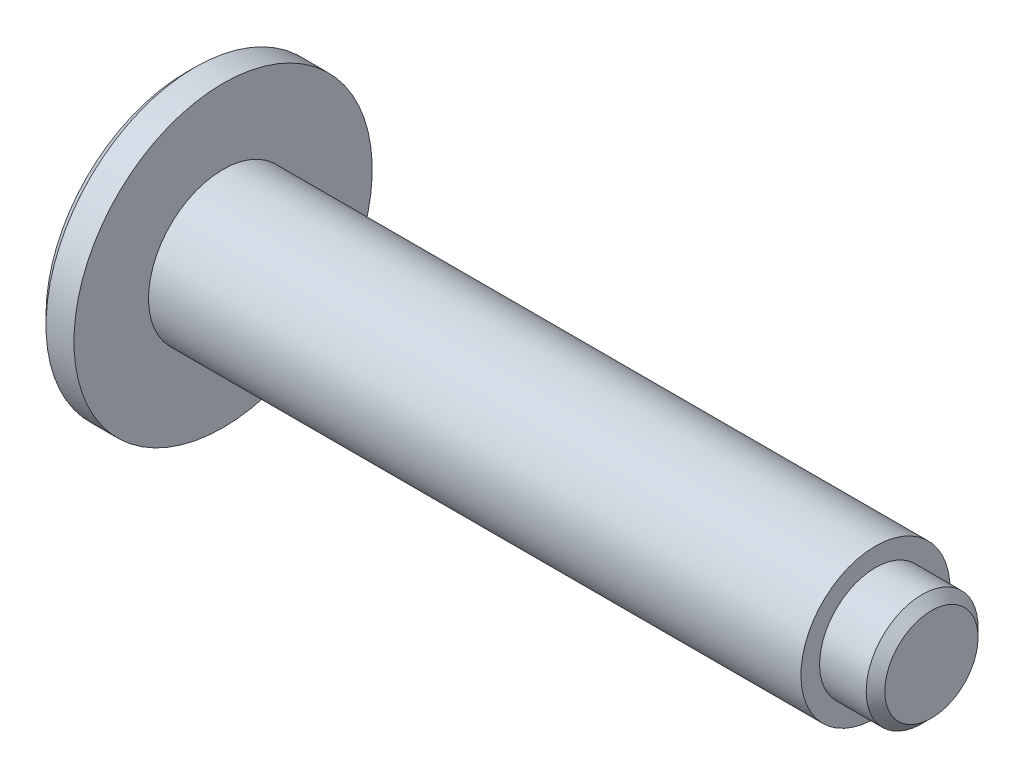
ISO-10303-21;
HEADER;
FILE_DESCRIPTION(('STEP AP214'),'2;1');
FILE_NAME('part.step','',(''),(''),'','','');
FILE_SCHEMA(('AUTOMOTIVE_DESIGN { 1 0 10303 214 1 1 1 1 }'));
ENDSEC;
DATA;
#1=APPLICATION_CONTEXT('core data for automotive mechanical design processes');
#2=APPLICATION_PROTOCOL_DEFINITION('international standard','automotive_design',2000,#1);
#3=PRODUCT_CONTEXT('',#1,'mechanical');
#4=PRODUCT('Part','Part','',(#3));
#5=PRODUCT_RELATED_PRODUCT_CATEGORY('part','',(#4));
#6=PRODUCT_DEFINITION_FORMATION('','',#4);
#7=PRODUCT_DEFINITION_CONTEXT('part definition',#1,'design');
#8=PRODUCT_DEFINITION('design','',#6,#7);
#9=PRODUCT_DEFINITION_SHAPE('','',#8);
#10=(LENGTH_UNIT() NAMED_UNIT(*) SI_UNIT(.MILLI.,.METRE.));
#11=(NAMED_UNIT(*) PLANE_ANGLE_UNIT() SI_UNIT($,.RADIAN.));
#12=(NAMED_UNIT(*) SI_UNIT($,.STERADIAN.) SOLID_ANGLE_UNIT());
#13=UNCERTAINTY_MEASURE_WITH_UNIT(LENGTH_MEASURE(1.E-05),#10,'distance_accuracy_value','');
#14=(GEOMETRIC_REPRESENTATION_CONTEXT(3) GLOBAL_UNCERTAINTY_ASSIGNED_CONTEXT((#13)) GLOBAL_UNIT_ASSIGNED_CONTEXT((#10,
#11,#12)) REPRESENTATION_CONTEXT('',''));
#15=CARTESIAN_POINT('',(0.,0.,0.));
#16=DIRECTION('',(0.,0.,1.));
#17=DIRECTION('',(1.,0.,0.));
#18=AXIS2_PLACEMENT_3D('',#15,#16,#17);
#19=CARTESIAN_POINT('',(-12.3013698630137,0.334637964774945,0.));
#20=DIRECTION('',(-1.,0.,0.));
#21=DIRECTION('',(0.,-1.,0.));
#22=AXIS2_PLACEMENT_3D('',#19,#20,#21);
#23=PLANE('',#22);
#24=CARTESIAN_POINT('',(-12.3013698630137,0.334637964774945,0.));
#25=DIRECTION('',(-1.,0.,0.));
#26=DIRECTION('',(0.,-1.,0.));
#27=AXIS2_PLACEMENT_3D('',#24,#25,#26);
#28=CIRCLE('',#27,7.49999999999997);
#29=CARTESIAN_POINT('',(-12.3013698630137,-7.16536203522503,0.));
#30=VERTEX_POINT('',#29);
#31=EDGE_CURVE('E45',#30,#30,#28,.T.);
#32=ORIENTED_EDGE('',*,*,#31,.T.);
#33=EDGE_LOOP('',(#32));
#34=FACE_BOUND('',#33,.T.);
#35=ADVANCED_FACE('F33',(#34),#23,.T.);
#36=CARTESIAN_POINT('',(27.6986301369863,0.33463796477495,0.));
#37=DIRECTION('',(1.,0.,0.));
#38=DIRECTION('',(0.,1.,0.));
#39=AXIS2_PLACEMENT_3D('',#36,#37,#38);
#40=CYLINDRICAL_SURFACE('',#39,8.);
#41=CARTESIAN_POINT('',(-11.8013698630137,0.334637964774945,0.));
#42=DIRECTION('',(-1.,0.,0.));
#43=DIRECTION('',(0.,-1.,0.));
#44=AXIS2_PLACEMENT_3D('',#41,#42,#43);
#45=CIRCLE('',#44,8.);
#46=CARTESIAN_POINT('',(-11.8013698630137,-7.66536203522505,0.));
#47=VERTEX_POINT('',#46);
#48=EDGE_CURVE('E49',#47,#47,#45,.F.);
#49=ORIENTED_EDGE('',*,*,#48,.T.);
#50=EDGE_LOOP('',(#49));
#51=FACE_BOUND('',#50,.T.);
#52=CARTESIAN_POINT('',(-10.3013698630137,0.334637964774946,0.));
#53=DIRECTION('',(1.,0.,0.));
#54=DIRECTION('',(0.,1.,0.));
#55=AXIS2_PLACEMENT_3D('',#52,#53,#54);
#56=CIRCLE('',#55,8.);
#57=CARTESIAN_POINT('',(-10.3013698630137,8.33463796477495,0.));
#58=VERTEX_POINT('',#57);
#59=EDGE_CURVE('E54',#58,#58,#56,.T.);
#60=ORIENTED_EDGE('',*,*,#59,.F.);
#61=EDGE_LOOP('',(#60));
#62=FACE_BOUND('',#61,.T.);
#63=ADVANCED_FACE('F84',(#51,#62),#40,.T.);
#64=CARTESIAN_POINT('',(-10.3013698630137,8.33463796477495,0.));
#65=DIRECTION('',(1.,0.,0.));
#66=DIRECTION('',(0.,1.,0.));
#67=AXIS2_PLACEMENT_3D('',#64,#65,#66);
#68=PLANE('',#67);
#69=ORIENTED_EDGE('',*,*,#59,.T.);
#70=EDGE_LOOP('',(#69));
#71=FACE_BOUND('',#70,.T.);
#72=CARTESIAN_POINT('',(-10.3013698630137,0.334637964774946,0.));
#73=DIRECTION('',(1.,0.,0.));
#74=DIRECTION('',(0.,1.,0.));
#75=AXIS2_PLACEMENT_3D('',#72,#73,#74);
#76=CIRCLE('',#75,4.);
#77=CARTESIAN_POINT('',(-10.3013698630137,4.33463796477495,0.));
#78=VERTEX_POINT('',#77);
#79=EDGE_CURVE('E57',#78,#78,#76,.T.);
#80=ORIENTED_EDGE('',*,*,#79,.F.);
#81=EDGE_LOOP('',(#80));
#82=FACE_BOUND('',#81,.T.);
#83=ADVANCED_FACE('F80',(#71,#82),#68,.T.);
#84=CARTESIAN_POINT('',(27.6986301369863,0.33463796477495,0.));
#85=DIRECTION('',(1.,0.,0.));
#86=DIRECTION('',(0.,1.,0.));
#87=AXIS2_PLACEMENT_3D('',#84,#85,#86);
#88=CYLINDRICAL_SURFACE('',#87,4.);
#89=ORIENTED_EDGE('',*,*,#79,.T.);
#90=EDGE_LOOP('',(#89));
#91=FACE_BOUND('',#90,.T.);
#92=CARTESIAN_POINT('',(24.6986301369863,0.33463796477495,0.));
#93=DIRECTION('',(1.,0.,0.));
#94=DIRECTION('',(0.,1.,0.));
#95=AXIS2_PLACEMENT_3D('',#92,#93,#94);
#96=CIRCLE('',#95,4.);
#97=CARTESIAN_POINT('',(24.6986301369863,4.33463796477495,0.));
#98=VERTEX_POINT('',#97);
#99=EDGE_CURVE('E60',#98,#98,#96,.T.);
#100=ORIENTED_EDGE('',*,*,#99,.F.);
#101=EDGE_LOOP('',(#100));
#102=FACE_BOUND('',#101,.T.);
#103=ADVANCED_FACE('F71',(#91,#102),#88,.T.);
#104=CARTESIAN_POINT('',(24.6986301369863,4.33463796477495,0.));
#105=DIRECTION('',(1.,0.,0.));
#106=DIRECTION('',(0.,1.,0.));
#107=AXIS2_PLACEMENT_3D('',#104,#105,#106);
#108=PLANE('',#107);
#109=ORIENTED_EDGE('',*,*,#99,.T.);
#110=EDGE_LOOP('',(#109));
#111=FACE_BOUND('',#110,.T.);
#112=CARTESIAN_POINT('',(24.6986301369863,0.33463796477495,0.));
#113=DIRECTION('',(1.,0.,0.));
#114=DIRECTION('',(0.,1.,0.));
#115=AXIS2_PLACEMENT_3D('',#112,#113,#114);
#116=CIRCLE('',#115,3.);
#117=CARTESIAN_POINT('',(24.6986301369863,3.33463796477495,0.));
#118=VERTEX_POINT('',#117);
#119=EDGE_CURVE('E63',#118,#118,#116,.T.);
#120=ORIENTED_EDGE('',*,*,#119,.F.);
#121=EDGE_LOOP('',(#120));
#122=FACE_BOUND('',#121,.T.);
#123=ADVANCED_FACE('F69',(#111,#122),#108,.T.);
#124=CARTESIAN_POINT('',(27.6986301369863,0.33463796477495,0.));
#125=DIRECTION('',(1.,0.,0.));
#126=DIRECTION('',(0.,1.,0.));
#127=AXIS2_PLACEMENT_3D('',#124,#125,#126);
#128=CYLINDRICAL_SURFACE('',#127,3.);
#129=CARTESIAN_POINT('',(27.1986301369863,0.33463796477495,0.));
#130=DIRECTION('',(1.,0.,0.));
#131=DIRECTION('',(0.,1.,0.));
#132=AXIS2_PLACEMENT_3D('',#129,#130,#131);
#133=CIRCLE('',#132,3.);
#134=CARTESIAN_POINT('',(27.1986301369863,3.33463796477495,0.));
#135=VERTEX_POINT('',#134);
#136=EDGE_CURVE('E10',#135,#135,#133,.F.);
#137=ORIENTED_EDGE('',*,*,#136,.T.);
#138=EDGE_LOOP('',(#137));
#139=FACE_BOUND('',#138,.T.);
#140=ORIENTED_EDGE('',*,*,#119,.T.);
#141=EDGE_LOOP('',(#140));
#142=FACE_BOUND('',#141,.T.);
#143=ADVANCED_FACE('F67',(#139,#142),#128,.T.);
#144=CARTESIAN_POINT('',(27.6986301369863,3.33463796477495,0.));
#145=DIRECTION('',(1.,0.,0.));
#146=DIRECTION('',(0.,1.,0.));
#147=AXIS2_PLACEMENT_3D('',#144,#145,#146);
#148=PLANE('',#147);
#149=CARTESIAN_POINT('',(27.6986301369863,0.33463796477495,0.));
#150=DIRECTION('',(1.,0.,0.));
#151=DIRECTION('',(0.,1.,0.));
#152=AXIS2_PLACEMENT_3D('',#149,#150,#151);
#153=CIRCLE('',#152,2.50000000000001);
#154=CARTESIAN_POINT('',(27.6986301369863,2.83463796477496,0.));
#155=VERTEX_POINT('',#154);
#156=EDGE_CURVE('E41',#155,#155,#153,.T.);
#157=ORIENTED_EDGE('',*,*,#156,.T.);
#158=EDGE_LOOP('',(#157));
#159=FACE_BOUND('',#158,.T.);
#160=ADVANCED_FACE('F78',(#159),#148,.T.);
#161=CARTESIAN_POINT('',(-11.8013698630137,0.334637964774945,0.));
#162=DIRECTION('',(1.,0.,0.));
#163=DIRECTION('',(0.,1.,0.));
#164=AXIS2_PLACEMENT_3D('',#161,#162,#163);
#165=CONICAL_SURFACE('',#164,8.,0.785398163397453);
#166=ORIENTED_EDGE('',*,*,#31,.F.);
#167=EDGE_LOOP('',(#166));
#168=FACE_BOUND('',#167,.T.);
#169=ORIENTED_EDGE('',*,*,#48,.F.);
#170=EDGE_LOOP('',(#169));
#171=FACE_BOUND('',#170,.T.);
#172=ADVANCED_FACE('F94',(#168,#171),#165,.T.);
#173=CARTESIAN_POINT('',(27.6986301369863,0.33463796477495,0.));
#174=DIRECTION('',(-1.,0.,0.));
#175=DIRECTION('',(0.,-1.,0.));
#176=AXIS2_PLACEMENT_3D('',#173,#174,#175);
#177=CONICAL_SURFACE('',#176,2.50000000000001,0.785398163397453);
#178=ORIENTED_EDGE('',*,*,#136,.F.);
#179=EDGE_LOOP('',(#178));
#180=FACE_BOUND('',#179,.T.);
#181=ORIENTED_EDGE('',*,*,#156,.F.);
#182=EDGE_LOOP('',(#181));
#183=FACE_BOUND('',#182,.T.);
#184=ADVANCED_FACE('F36',(#180,#183),#177,.T.);
#185=CLOSED_SHELL('',(#35,#63,#83,#103,#123,#143,#160,#172,#184));
#186=MANIFOLD_SOLID_BREP('B2',#185);
#187=ADVANCED_BREP_SHAPE_REPRESENTATION('',(#18,#186),#14);
#188=SHAPE_DEFINITION_REPRESENTATION(#9,#187);
ENDSEC;
END-ISO-10303-21;
